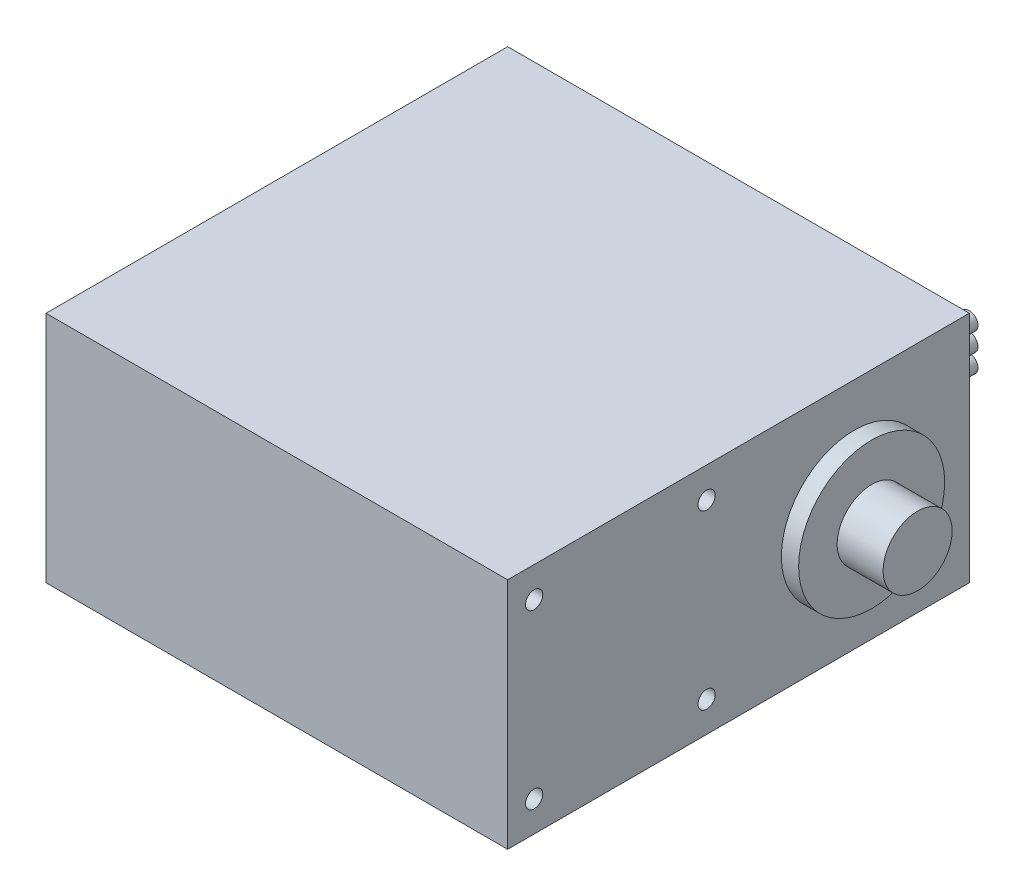
ISO-10303-21;
HEADER;
FILE_DESCRIPTION(('STEP AP214'),'2;1');
FILE_NAME('part.step','',(''),(''),'','','');
FILE_SCHEMA(('AUTOMOTIVE_DESIGN { 1 0 10303 214 1 1 1 1 }'));
ENDSEC;
DATA;
#1=APPLICATION_CONTEXT('core data for automotive mechanical design processes');
#2=APPLICATION_PROTOCOL_DEFINITION('international standard','automotive_design',2000,#1);
#3=PRODUCT_CONTEXT('',#1,'mechanical');
#4=PRODUCT('Part','Part','',(#3));
#5=PRODUCT_RELATED_PRODUCT_CATEGORY('part','',(#4));
#6=PRODUCT_DEFINITION_FORMATION('','',#4);
#7=PRODUCT_DEFINITION_CONTEXT('part definition',#1,'design');
#8=PRODUCT_DEFINITION('design','',#6,#7);
#9=PRODUCT_DEFINITION_SHAPE('','',#8);
#10=(LENGTH_UNIT() NAMED_UNIT(*) SI_UNIT(.MILLI.,.METRE.));
#11=(NAMED_UNIT(*) PLANE_ANGLE_UNIT() SI_UNIT($,.RADIAN.));
#12=(NAMED_UNIT(*) SI_UNIT($,.STERADIAN.) SOLID_ANGLE_UNIT());
#13=UNCERTAINTY_MEASURE_WITH_UNIT(LENGTH_MEASURE(1.E-05),#10,'distance_accuracy_value','');
#14=(GEOMETRIC_REPRESENTATION_CONTEXT(3) GLOBAL_UNCERTAINTY_ASSIGNED_CONTEXT((#13)) GLOBAL_UNIT_ASSIGNED_CONTEXT((#10,
#11,#12)) REPRESENTATION_CONTEXT('',''));
#15=CARTESIAN_POINT('',(0.,0.,0.));
#16=DIRECTION('',(0.,0.,1.));
#17=DIRECTION('',(1.,0.,0.));
#18=AXIS2_PLACEMENT_3D('',#15,#16,#17);
#19=CARTESIAN_POINT('',(-20.075,10.15,-20.075));
#20=DIRECTION('',(0.,0.,1.));
#21=DIRECTION('',(1.,0.,0.));
#22=AXIS2_PLACEMENT_3D('',#19,#20,#21);
#23=PLANE('',#22);
#24=DIRECTION('',(-1.,0.,0.));
#25=VECTOR('',#24,1.);
#26=CARTESIAN_POINT('',(-20.075,-10.15,-20.075));
#27=LINE('',#26,#25);
#28=CARTESIAN_POINT('',(20.075,-10.15,-20.075));
#29=VERTEX_POINT('',#28);
#30=CARTESIAN_POINT('',(-20.075,-10.15,-20.075));
#31=VERTEX_POINT('',#30);
#32=EDGE_CURVE('E162',#29,#31,#27,.T.);
#33=ORIENTED_EDGE('',*,*,#32,.T.);
#34=DIRECTION('',(0.,-1.,0.));
#35=VECTOR('',#34,1.);
#36=CARTESIAN_POINT('',(-20.075,10.15,-20.075));
#37=LINE('',#36,#35);
#38=CARTESIAN_POINT('',(-20.075,10.15,-20.075));
#39=VERTEX_POINT('',#38);
#40=EDGE_CURVE('E168',#39,#31,#37,.T.);
#41=ORIENTED_EDGE('',*,*,#40,.F.);
#42=DIRECTION('',(-1.,0.,0.));
#43=VECTOR('',#42,1.);
#44=CARTESIAN_POINT('',(-20.075,10.15,-20.075));
#45=LINE('',#44,#43);
#46=CARTESIAN_POINT('',(20.075,10.15,-20.075));
#47=VERTEX_POINT('',#46);
#48=EDGE_CURVE('E166',#47,#39,#45,.T.);
#49=ORIENTED_EDGE('',*,*,#48,.F.);
#50=DIRECTION('',(0.,-1.,0.));
#51=VECTOR('',#50,1.);
#52=CARTESIAN_POINT('',(20.075,10.15,-20.075));
#53=LINE('',#52,#51);
#54=EDGE_CURVE('E178',#47,#29,#53,.T.);
#55=ORIENTED_EDGE('',*,*,#54,.T.);
#56=EDGE_LOOP('',(#33,#41,#49,#55));
#57=FACE_BOUND('',#56,.T.);
#58=DIRECTION('',(1.,0.,0.));
#59=VECTOR('',#58,1.);
#60=CARTESIAN_POINT('',(14.075,4.15,-20.075));
#61=LINE('',#60,#59);
#62=CARTESIAN_POINT('',(10.075,4.15,-20.075));
#63=VERTEX_POINT('',#62);
#64=CARTESIAN_POINT('',(14.075,4.15,-20.075));
#65=VERTEX_POINT('',#64);
#66=EDGE_CURVE('E124',#63,#65,#61,.T.);
#67=ORIENTED_EDGE('',*,*,#66,.F.);
#68=DIRECTION('',(0.,1.,0.));
#69=VECTOR('',#68,1.);
#70=CARTESIAN_POINT('',(10.075,4.15,-20.075));
#71=LINE('',#70,#69);
#72=CARTESIAN_POINT('',(10.075,-4.15,-20.075));
#73=VERTEX_POINT('',#72);
#74=EDGE_CURVE('E121',#73,#63,#71,.T.);
#75=ORIENTED_EDGE('',*,*,#74,.F.);
#76=DIRECTION('',(-1.,0.,0.));
#77=VECTOR('',#76,1.);
#78=CARTESIAN_POINT('',(14.075,-4.15,-20.075));
#79=LINE('',#78,#77);
#80=CARTESIAN_POINT('',(14.075,-4.15,-20.075));
#81=VERTEX_POINT('',#80);
#82=EDGE_CURVE('E56',#81,#73,#79,.T.);
#83=ORIENTED_EDGE('',*,*,#82,.F.);
#84=DIRECTION('',(0.,-1.,0.));
#85=VECTOR('',#84,1.);
#86=CARTESIAN_POINT('',(14.075,4.15,-20.075));
#87=LINE('',#86,#85);
#88=EDGE_CURVE('E51',#65,#81,#87,.T.);
#89=ORIENTED_EDGE('',*,*,#88,.F.);
#90=EDGE_LOOP('',(#67,#75,#83,#89));
#91=FACE_BOUND('',#90,.T.);
#92=ADVANCED_FACE('F36',(#57,#91),#23,.F.);
#93=CARTESIAN_POINT('',(-20.075,10.15,20.075));
#94=DIRECTION('',(1.,0.,0.));
#95=DIRECTION('',(0.,0.,-1.));
#96=AXIS2_PLACEMENT_3D('',#93,#94,#95);
#97=PLANE('',#96);
#98=CARTESIAN_POINT('',(-20.075,0.,17.275));
#99=DIRECTION('',(-1.,0.,0.));
#100=DIRECTION('',(0.,0.,1.));
#101=AXIS2_PLACEMENT_3D('',#98,#99,#100);
#102=CIRCLE('',#101,0.750000000000002);
#103=CARTESIAN_POINT('',(-20.075,0.,18.025));
#104=VERTEX_POINT('',#103);
#105=EDGE_CURVE('E557',#104,#104,#102,.T.);
#106=ORIENTED_EDGE('',*,*,#105,.F.);
#107=EDGE_LOOP('',(#106));
#108=FACE_BOUND('',#107,.T.);
#109=CARTESIAN_POINT('',(-20.075,7.,10.275));
#110=DIRECTION('',(-1.,0.,0.));
#111=DIRECTION('',(0.,0.,1.));
#112=AXIS2_PLACEMENT_3D('',#109,#110,#111);
#113=CIRCLE('',#112,0.75);
#114=CARTESIAN_POINT('',(-20.075,7.,11.025));
#115=VERTEX_POINT('',#114);
#116=EDGE_CURVE('E568',#115,#115,#113,.T.);
#117=ORIENTED_EDGE('',*,*,#116,.F.);
#118=EDGE_LOOP('',(#117));
#119=FACE_BOUND('',#118,.T.);
#120=CARTESIAN_POINT('',(-20.075,-7.,10.275));
#121=DIRECTION('',(-1.,0.,0.));
#122=DIRECTION('',(0.,0.,-1.));
#123=AXIS2_PLACEMENT_3D('',#120,#121,#122);
#124=CIRCLE('',#123,0.75);
#125=CARTESIAN_POINT('',(-20.075,-7.,9.525));
#126=VERTEX_POINT('',#125);
#127=EDGE_CURVE('E574',#126,#126,#124,.T.);
#128=ORIENTED_EDGE('',*,*,#127,.F.);
#129=EDGE_LOOP('',(#128));
#130=FACE_BOUND('',#129,.T.);
#131=CARTESIAN_POINT('',(-20.075,0.,-10.075));
#132=DIRECTION('',(1.,0.,0.));
#133=DIRECTION('',(0.,0.,-1.));
#134=AXIS2_PLACEMENT_3D('',#131,#132,#133);
#135=CIRCLE('',#134,6.15);
#136=CARTESIAN_POINT('',(-20.075,0.,-16.225));
#137=VERTEX_POINT('',#136);
#138=EDGE_CURVE('E154',#137,#137,#135,.F.);
#139=ORIENTED_EDGE('',*,*,#138,.F.);
#140=EDGE_LOOP('',(#139));
#141=FACE_BOUND('',#140,.T.);
#142=DIRECTION('',(0.,0.,1.));
#143=VECTOR('',#142,1.);
#144=CARTESIAN_POINT('',(-20.075,-10.15,20.075));
#145=LINE('',#144,#143);
#146=CARTESIAN_POINT('',(-20.075,-10.15,20.075));
#147=VERTEX_POINT('',#146);
#148=EDGE_CURVE('E157',#31,#147,#145,.T.);
#149=ORIENTED_EDGE('',*,*,#148,.T.);
#150=DIRECTION('',(0.,-1.,0.));
#151=VECTOR('',#150,1.);
#152=CARTESIAN_POINT('',(-20.075,10.15,20.075));
#153=LINE('',#152,#151);
#154=CARTESIAN_POINT('',(-20.075,10.15,20.075));
#155=VERTEX_POINT('',#154);
#156=EDGE_CURVE('E184',#155,#147,#153,.T.);
#157=ORIENTED_EDGE('',*,*,#156,.F.);
#158=DIRECTION('',(0.,0.,1.));
#159=VECTOR('',#158,1.);
#160=CARTESIAN_POINT('',(-20.075,10.15,20.075));
#161=LINE('',#160,#159);
#162=EDGE_CURVE('E158',#39,#155,#161,.T.);
#163=ORIENTED_EDGE('',*,*,#162,.F.);
#164=ORIENTED_EDGE('',*,*,#40,.T.);
#165=EDGE_LOOP('',(#149,#157,#163,#164));
#166=FACE_BOUND('',#165,.T.);
#167=ADVANCED_FACE('F38',(#108,#119,#130,#141,#166),#97,.F.);
#168=CARTESIAN_POINT('',(-20.075,10.15,20.075));
#169=DIRECTION('',(0.,0.,-1.));
#170=DIRECTION('',(-1.,0.,0.));
#171=AXIS2_PLACEMENT_3D('',#168,#169,#170);
#172=PLANE('',#171);
#173=DIRECTION('',(1.,0.,0.));
#174=VECTOR('',#173,1.);
#175=CARTESIAN_POINT('',(-20.075,-10.15,20.075));
#176=LINE('',#175,#174);
#177=CARTESIAN_POINT('',(20.075,-10.15,20.075));
#178=VERTEX_POINT('',#177);
#179=EDGE_CURVE('E171',#147,#178,#176,.T.);
#180=ORIENTED_EDGE('',*,*,#179,.T.);
#181=DIRECTION('',(0.,-1.,0.));
#182=VECTOR('',#181,1.);
#183=CARTESIAN_POINT('',(20.075,10.15,20.075));
#184=LINE('',#183,#182);
#185=CARTESIAN_POINT('',(20.075,10.15,20.075));
#186=VERTEX_POINT('',#185);
#187=EDGE_CURVE('E181',#186,#178,#184,.T.);
#188=ORIENTED_EDGE('',*,*,#187,.F.);
#189=DIRECTION('',(1.,0.,0.));
#190=VECTOR('',#189,1.);
#191=CARTESIAN_POINT('',(-20.075,10.15,20.075));
#192=LINE('',#191,#190);
#193=EDGE_CURVE('E161',#155,#186,#192,.T.);
#194=ORIENTED_EDGE('',*,*,#193,.F.);
#195=ORIENTED_EDGE('',*,*,#156,.T.);
#196=EDGE_LOOP('',(#180,#188,#194,#195));
#197=FACE_BOUND('',#196,.T.);
#198=ADVANCED_FACE('F229',(#197),#172,.F.);
#199=CARTESIAN_POINT('',(20.075,10.15,20.075));
#200=DIRECTION('',(-1.,0.,0.));
#201=DIRECTION('',(0.,0.,1.));
#202=AXIS2_PLACEMENT_3D('',#199,#200,#201);
#203=PLANE('',#202);
#204=CARTESIAN_POINT('',(20.075,7.5,2.77499999999999));
#205=DIRECTION('',(1.,0.,0.));
#206=DIRECTION('',(0.,0.,-1.));
#207=AXIS2_PLACEMENT_3D('',#204,#205,#206);
#208=CIRCLE('',#207,0.75);
#209=CARTESIAN_POINT('',(20.075,7.5,2.02499999999999));
#210=VERTEX_POINT('',#209);
#211=EDGE_CURVE('E584',#210,#210,#208,.T.);
#212=ORIENTED_EDGE('',*,*,#211,.F.);
#213=EDGE_LOOP('',(#212));
#214=FACE_BOUND('',#213,.T.);
#215=CARTESIAN_POINT('',(20.075,-7.5,17.775));
#216=DIRECTION('',(1.,0.,0.));
#217=DIRECTION('',(0.,0.,-1.));
#218=AXIS2_PLACEMENT_3D('',#215,#216,#217);
#219=CIRCLE('',#218,0.750000000000002);
#220=CARTESIAN_POINT('',(20.075,-7.5,17.025));
#221=VERTEX_POINT('',#220);
#222=EDGE_CURVE('E578',#221,#221,#219,.T.);
#223=ORIENTED_EDGE('',*,*,#222,.F.);
#224=EDGE_LOOP('',(#223));
#225=FACE_BOUND('',#224,.T.);
#226=CARTESIAN_POINT('',(20.075,-7.5,2.77499999999999));
#227=DIRECTION('',(1.,0.,0.));
#228=DIRECTION('',(0.,0.,-1.));
#229=AXIS2_PLACEMENT_3D('',#226,#227,#228);
#230=CIRCLE('',#229,0.75);
#231=CARTESIAN_POINT('',(20.075,-7.5,2.02499999999999));
#232=VERTEX_POINT('',#231);
#233=EDGE_CURVE('E556',#232,#232,#230,.T.);
#234=ORIENTED_EDGE('',*,*,#233,.F.);
#235=EDGE_LOOP('',(#234));
#236=FACE_BOUND('',#235,.T.);
#237=CARTESIAN_POINT('',(20.075,7.5,17.775));
#238=DIRECTION('',(1.,0.,0.));
#239=DIRECTION('',(0.,0.,-1.));
#240=AXIS2_PLACEMENT_3D('',#237,#238,#239);
#241=CIRCLE('',#240,0.750000000000002);
#242=CARTESIAN_POINT('',(20.075,7.5,17.025));
#243=VERTEX_POINT('',#242);
#244=EDGE_CURVE('E583',#243,#243,#241,.T.);
#245=ORIENTED_EDGE('',*,*,#244,.F.);
#246=EDGE_LOOP('',(#245));
#247=FACE_BOUND('',#246,.T.);
#248=CARTESIAN_POINT('',(20.075,0.,-10.075));
#249=DIRECTION('',(-1.,0.,0.));
#250=DIRECTION('',(0.,0.,1.));
#251=AXIS2_PLACEMENT_3D('',#248,#249,#250);
#252=CIRCLE('',#251,6.35);
#253=CARTESIAN_POINT('',(20.075,0.,-3.725));
#254=VERTEX_POINT('',#253);
#255=EDGE_CURVE('E138',#254,#254,#252,.F.);
#256=ORIENTED_EDGE('',*,*,#255,.F.);
#257=EDGE_LOOP('',(#256));
#258=FACE_BOUND('',#257,.T.);
#259=DIRECTION('',(0.,0.,-1.));
#260=VECTOR('',#259,1.);
#261=CARTESIAN_POINT('',(20.075,-10.15,20.075));
#262=LINE('',#261,#260);
#263=EDGE_CURVE('E173',#178,#29,#262,.T.);
#264=ORIENTED_EDGE('',*,*,#263,.T.);
#265=ORIENTED_EDGE('',*,*,#54,.F.);
#266=DIRECTION('',(0.,0.,-1.));
#267=VECTOR('',#266,1.);
#268=CARTESIAN_POINT('',(20.075,10.15,20.075));
#269=LINE('',#268,#267);
#270=EDGE_CURVE('E164',#186,#47,#269,.T.);
#271=ORIENTED_EDGE('',*,*,#270,.F.);
#272=ORIENTED_EDGE('',*,*,#187,.T.);
#273=EDGE_LOOP('',(#264,#265,#271,#272));
#274=FACE_BOUND('',#273,.T.);
#275=ADVANCED_FACE('F235',(#214,#225,#236,#247,#258,#274),#203,.F.);
#276=CARTESIAN_POINT('',(0.,10.15,0.));
#277=DIRECTION('',(0.,-1.,0.));
#278=DIRECTION('',(0.,0.,-1.));
#279=AXIS2_PLACEMENT_3D('',#276,#277,#278);
#280=PLANE('',#279);
#281=ORIENTED_EDGE('',*,*,#162,.T.);
#282=ORIENTED_EDGE('',*,*,#193,.T.);
#283=ORIENTED_EDGE('',*,*,#270,.T.);
#284=ORIENTED_EDGE('',*,*,#48,.T.);
#285=EDGE_LOOP('',(#281,#282,#283,#284));
#286=FACE_BOUND('',#285,.T.);
#287=ADVANCED_FACE('F237',(#286),#280,.F.);
#288=CARTESIAN_POINT('',(0.,-10.15,0.));
#289=DIRECTION('',(0.,-1.,0.));
#290=DIRECTION('',(0.,0.,-1.));
#291=AXIS2_PLACEMENT_3D('',#288,#289,#290);
#292=PLANE('',#291);
#293=ORIENTED_EDGE('',*,*,#148,.F.);
#294=ORIENTED_EDGE('',*,*,#32,.F.);
#295=ORIENTED_EDGE('',*,*,#263,.F.);
#296=ORIENTED_EDGE('',*,*,#179,.F.);
#297=EDGE_LOOP('',(#293,#294,#295,#296));
#298=FACE_BOUND('',#297,.T.);
#299=ADVANCED_FACE('F233',(#298),#292,.T.);
#300=CARTESIAN_POINT('',(-21.575,0.,-10.075));
#301=DIRECTION('',(1.,0.,0.));
#302=DIRECTION('',(0.,0.,-1.));
#303=AXIS2_PLACEMENT_3D('',#300,#301,#302);
#304=CYLINDRICAL_SURFACE('',#303,6.15);
#305=CARTESIAN_POINT('',(-21.575,0.,-10.075));
#306=DIRECTION('',(-1.,0.,0.));
#307=DIRECTION('',(0.,0.,1.));
#308=AXIS2_PLACEMENT_3D('',#305,#306,#307);
#309=CIRCLE('',#308,6.15);
#310=CARTESIAN_POINT('',(-21.575,0.,-3.925));
#311=VERTEX_POINT('',#310);
#312=EDGE_CURVE('E150',#311,#311,#309,.T.);
#313=ORIENTED_EDGE('',*,*,#312,.F.);
#314=EDGE_LOOP('',(#313));
#315=FACE_BOUND('',#314,.T.);
#316=ORIENTED_EDGE('',*,*,#138,.T.);
#317=EDGE_LOOP('',(#316));
#318=FACE_BOUND('',#317,.T.);
#319=ADVANCED_FACE('F261',(#315,#318),#304,.T.);
#320=CARTESIAN_POINT('',(-21.575,0.,-10.075));
#321=DIRECTION('',(-1.,0.,0.));
#322=DIRECTION('',(0.,0.,1.));
#323=AXIS2_PLACEMENT_3D('',#320,#321,#322);
#324=PLANE('',#323);
#325=CARTESIAN_POINT('',(-21.575,0.,-10.075));
#326=DIRECTION('',(-1.,0.,0.));
#327=DIRECTION('',(0.,0.,1.));
#328=AXIS2_PLACEMENT_3D('',#325,#326,#327);
#329=CIRCLE('',#328,2.9);
#330=CARTESIAN_POINT('',(-21.575,0.,-7.175));
#331=VERTEX_POINT('',#330);
#332=EDGE_CURVE('E151',#331,#331,#329,.T.);
#333=ORIENTED_EDGE('',*,*,#332,.F.);
#334=EDGE_LOOP('',(#333));
#335=FACE_BOUND('',#334,.T.);
#336=ORIENTED_EDGE('',*,*,#312,.T.);
#337=EDGE_LOOP('',(#336));
#338=FACE_BOUND('',#337,.T.);
#339=ADVANCED_FACE('F265',(#335,#338),#324,.T.);
#340=CARTESIAN_POINT('',(-25.925,0.,-10.075));
#341=DIRECTION('',(1.,0.,0.));
#342=DIRECTION('',(0.,0.,-1.));
#343=AXIS2_PLACEMENT_3D('',#340,#341,#342);
#344=CYLINDRICAL_SURFACE('',#343,2.9);
#345=CARTESIAN_POINT('',(-25.925,0.,-10.075));
#346=DIRECTION('',(-1.,0.,0.));
#347=DIRECTION('',(0.,0.,1.));
#348=AXIS2_PLACEMENT_3D('',#345,#346,#347);
#349=CIRCLE('',#348,2.9);
#350=CARTESIAN_POINT('',(-25.925,0.,-7.175));
#351=VERTEX_POINT('',#350);
#352=EDGE_CURVE('E147',#351,#351,#349,.T.);
#353=ORIENTED_EDGE('',*,*,#352,.F.);
#354=EDGE_LOOP('',(#353));
#355=FACE_BOUND('',#354,.T.);
#356=ORIENTED_EDGE('',*,*,#332,.T.);
#357=EDGE_LOOP('',(#356));
#358=FACE_BOUND('',#357,.T.);
#359=ADVANCED_FACE('F269',(#355,#358),#344,.T.);
#360=CARTESIAN_POINT('',(-25.925,0.,-10.075));
#361=DIRECTION('',(-1.,0.,0.));
#362=DIRECTION('',(0.,0.,1.));
#363=AXIS2_PLACEMENT_3D('',#360,#361,#362);
#364=PLANE('',#363);
#365=CARTESIAN_POINT('',(-25.925,0.,-10.075));
#366=DIRECTION('',(-1.,0.,0.));
#367=DIRECTION('',(0.,0.,1.));
#368=AXIS2_PLACEMENT_3D('',#365,#366,#367);
#369=CIRCLE('',#368,1.5);
#370=CARTESIAN_POINT('',(-25.925,0.,-8.575));
#371=VERTEX_POINT('',#370);
#372=EDGE_CURVE('E141',#371,#371,#369,.T.);
#373=ORIENTED_EDGE('',*,*,#372,.F.);
#374=EDGE_LOOP('',(#373));
#375=FACE_BOUND('',#374,.T.);
#376=ORIENTED_EDGE('',*,*,#352,.T.);
#377=EDGE_LOOP('',(#376));
#378=FACE_BOUND('',#377,.T.);
#379=ADVANCED_FACE('F273',(#375,#378),#364,.T.);
#380=CARTESIAN_POINT('',(-19.925,0.,-10.075));
#381=DIRECTION('',(-1.,0.,0.));
#382=DIRECTION('',(0.,0.,1.));
#383=AXIS2_PLACEMENT_3D('',#380,#381,#382);
#384=CONICAL_SURFACE('',#383,1.5,1.02974425867665);
#385=CARTESIAN_POINT('',(-19.0237090714587,0.,-10.075));
#386=VERTEX_POINT('',#385);
#387=VERTEX_LOOP('',#386);
#388=FACE_BOUND('',#387,.T.);
#389=CARTESIAN_POINT('',(-19.925,0.,-10.075));
#390=DIRECTION('',(-1.,0.,0.));
#391=DIRECTION('',(0.,0.,1.));
#392=AXIS2_PLACEMENT_3D('',#389,#390,#391);
#393=CIRCLE('',#392,1.5);
#394=CARTESIAN_POINT('',(-19.925,0.,-8.575));
#395=VERTEX_POINT('',#394);
#396=EDGE_CURVE('E144',#395,#395,#393,.T.);
#397=ORIENTED_EDGE('',*,*,#396,.T.);
#398=EDGE_LOOP('',(#397));
#399=FACE_BOUND('',#398,.T.);
#400=ADVANCED_FACE('F277',(#388,#399),#384,.F.);
#401=CARTESIAN_POINT('',(-25.925,0.,-10.075));
#402=DIRECTION('',(-1.,0.,0.));
#403=DIRECTION('',(0.,0.,1.));
#404=AXIS2_PLACEMENT_3D('',#401,#402,#403);
#405=CYLINDRICAL_SURFACE('',#404,1.5);
#406=ORIENTED_EDGE('',*,*,#396,.F.);
#407=EDGE_LOOP('',(#406));
#408=FACE_BOUND('',#407,.T.);
#409=ORIENTED_EDGE('',*,*,#372,.T.);
#410=EDGE_LOOP('',(#409));
#411=FACE_BOUND('',#410,.T.);
#412=ADVANCED_FACE('F281',(#408,#411),#405,.F.);
#413=CARTESIAN_POINT('',(21.575,0.,-10.075));
#414=DIRECTION('',(-1.,0.,0.));
#415=DIRECTION('',(0.,0.,1.));
#416=AXIS2_PLACEMENT_3D('',#413,#414,#415);
#417=CYLINDRICAL_SURFACE('',#416,6.35);
#418=CARTESIAN_POINT('',(21.575,0.,-10.075));
#419=DIRECTION('',(1.,0.,0.));
#420=DIRECTION('',(0.,0.,-1.));
#421=AXIS2_PLACEMENT_3D('',#418,#419,#420);
#422=CIRCLE('',#421,6.35);
#423=CARTESIAN_POINT('',(21.575,0.,-16.425));
#424=VERTEX_POINT('',#423);
#425=EDGE_CURVE('E128',#424,#424,#422,.T.);
#426=ORIENTED_EDGE('',*,*,#425,.F.);
#427=EDGE_LOOP('',(#426));
#428=FACE_BOUND('',#427,.T.);
#429=ORIENTED_EDGE('',*,*,#255,.T.);
#430=EDGE_LOOP('',(#429));
#431=FACE_BOUND('',#430,.T.);
#432=ADVANCED_FACE('F285',(#428,#431),#417,.T.);
#433=CARTESIAN_POINT('',(21.575,0.,-10.075));
#434=DIRECTION('',(1.,0.,0.));
#435=DIRECTION('',(0.,0.,-1.));
#436=AXIS2_PLACEMENT_3D('',#433,#434,#435);
#437=PLANE('',#436);
#438=CARTESIAN_POINT('',(21.575,0.,-10.075));
#439=DIRECTION('',(1.,0.,0.));
#440=DIRECTION('',(0.,0.,-1.));
#441=AXIS2_PLACEMENT_3D('',#438,#439,#440);
#442=CIRCLE('',#441,3.);
#443=CARTESIAN_POINT('',(21.575,0.,-13.075));
#444=VERTEX_POINT('',#443);
#445=EDGE_CURVE('E134',#444,#444,#442,.T.);
#446=ORIENTED_EDGE('',*,*,#445,.F.);
#447=EDGE_LOOP('',(#446));
#448=FACE_BOUND('',#447,.T.);
#449=ORIENTED_EDGE('',*,*,#425,.T.);
#450=EDGE_LOOP('',(#449));
#451=FACE_BOUND('',#450,.T.);
#452=ADVANCED_FACE('F289',(#448,#451),#437,.T.);
#453=CARTESIAN_POINT('',(25.575,0.,-10.075));
#454=DIRECTION('',(-1.,0.,0.));
#455=DIRECTION('',(0.,0.,1.));
#456=AXIS2_PLACEMENT_3D('',#453,#454,#455);
#457=CYLINDRICAL_SURFACE('',#456,3.);
#458=CARTESIAN_POINT('',(25.575,0.,-10.075));
#459=DIRECTION('',(1.,0.,0.));
#460=DIRECTION('',(0.,0.,-1.));
#461=AXIS2_PLACEMENT_3D('',#458,#459,#460);
#462=CIRCLE('',#461,3.);
#463=CARTESIAN_POINT('',(25.575,0.,-13.075));
#464=VERTEX_POINT('',#463);
#465=EDGE_CURVE('E125',#464,#464,#462,.T.);
#466=ORIENTED_EDGE('',*,*,#465,.F.);
#467=EDGE_LOOP('',(#466));
#468=FACE_BOUND('',#467,.T.);
#469=ORIENTED_EDGE('',*,*,#445,.T.);
#470=EDGE_LOOP('',(#469));
#471=FACE_BOUND('',#470,.T.);
#472=ADVANCED_FACE('F293',(#468,#471),#457,.T.);
#473=CARTESIAN_POINT('',(25.575,0.,-10.075));
#474=DIRECTION('',(1.,0.,0.));
#475=DIRECTION('',(0.,0.,-1.));
#476=AXIS2_PLACEMENT_3D('',#473,#474,#475);
#477=PLANE('',#476);
#478=ORIENTED_EDGE('',*,*,#465,.T.);
#479=EDGE_LOOP('',(#478));
#480=FACE_BOUND('',#479,.T.);
#481=ADVANCED_FACE('F297',(#480),#477,.T.);
#482=CARTESIAN_POINT('',(14.075,4.15,-24.075));
#483=DIRECTION('',(0.,-1.,0.));
#484=DIRECTION('',(1.,0.,0.));
#485=AXIS2_PLACEMENT_3D('',#482,#483,#484);
#486=PLANE('',#485);
#487=ORIENTED_EDGE('',*,*,#66,.T.);
#488=DIRECTION('',(0.,0.,1.));
#489=VECTOR('',#488,1.);
#490=CARTESIAN_POINT('',(14.075,4.15,-24.075));
#491=LINE('',#490,#489);
#492=CARTESIAN_POINT('',(14.075,4.15,-24.075));
#493=VERTEX_POINT('',#492);
#494=EDGE_CURVE('E105',#493,#65,#491,.T.);
#495=ORIENTED_EDGE('',*,*,#494,.F.);
#496=DIRECTION('',(1.,0.,0.));
#497=VECTOR('',#496,1.);
#498=CARTESIAN_POINT('',(14.075,4.15,-24.075));
#499=LINE('',#498,#497);
#500=CARTESIAN_POINT('',(10.075,4.15,-24.075));
#501=VERTEX_POINT('',#500);
#502=EDGE_CURVE('E112',#501,#493,#499,.T.);
#503=ORIENTED_EDGE('',*,*,#502,.F.);
#504=DIRECTION('',(0.,0.,1.));
#505=VECTOR('',#504,1.);
#506=CARTESIAN_POINT('',(10.075,4.15,-24.075));
#507=LINE('',#506,#505);
#508=EDGE_CURVE('E203',#501,#63,#507,.T.);
#509=ORIENTED_EDGE('',*,*,#508,.T.);
#510=EDGE_LOOP('',(#487,#495,#503,#509));
#511=FACE_BOUND('',#510,.T.);
#512=ADVANCED_FACE('F123',(#511),#486,.F.);
#513=CARTESIAN_POINT('',(14.075,4.15,-24.075));
#514=DIRECTION('',(-1.,0.,0.));
#515=DIRECTION('',(0.,-1.,0.));
#516=AXIS2_PLACEMENT_3D('',#513,#514,#515);
#517=PLANE('',#516);
#518=ORIENTED_EDGE('',*,*,#88,.T.);
#519=DIRECTION('',(0.,0.,1.));
#520=VECTOR('',#519,1.);
#521=CARTESIAN_POINT('',(14.075,-4.15,-24.075));
#522=LINE('',#521,#520);
#523=CARTESIAN_POINT('',(14.075,-4.15,-24.075));
#524=VERTEX_POINT('',#523);
#525=EDGE_CURVE('E108',#524,#81,#522,.T.);
#526=ORIENTED_EDGE('',*,*,#525,.F.);
#527=DIRECTION('',(0.,-1.,0.));
#528=VECTOR('',#527,1.);
#529=CARTESIAN_POINT('',(14.075,4.15,-24.075));
#530=LINE('',#529,#528);
#531=EDGE_CURVE('E101',#493,#524,#530,.T.);
#532=ORIENTED_EDGE('',*,*,#531,.F.);
#533=ORIENTED_EDGE('',*,*,#494,.T.);
#534=EDGE_LOOP('',(#518,#526,#532,#533));
#535=FACE_BOUND('',#534,.T.);
#536=ADVANCED_FACE('F103',(#535),#517,.F.);
#537=CARTESIAN_POINT('',(14.075,-4.15,-24.075));
#538=DIRECTION('',(0.,1.,0.));
#539=DIRECTION('',(0.,0.,1.));
#540=AXIS2_PLACEMENT_3D('',#537,#538,#539);
#541=PLANE('',#540);
#542=ORIENTED_EDGE('',*,*,#82,.T.);
#543=DIRECTION('',(0.,0.,1.));
#544=VECTOR('',#543,1.);
#545=CARTESIAN_POINT('',(10.075,-4.15,-24.075));
#546=LINE('',#545,#544);
#547=CARTESIAN_POINT('',(10.075,-4.15,-24.075));
#548=VERTEX_POINT('',#547);
#549=EDGE_CURVE('E130',#548,#73,#546,.T.);
#550=ORIENTED_EDGE('',*,*,#549,.F.);
#551=DIRECTION('',(-1.,0.,0.));
#552=VECTOR('',#551,1.);
#553=CARTESIAN_POINT('',(14.075,-4.15,-24.075));
#554=LINE('',#553,#552);
#555=EDGE_CURVE('E111',#524,#548,#554,.T.);
#556=ORIENTED_EDGE('',*,*,#555,.F.);
#557=ORIENTED_EDGE('',*,*,#525,.T.);
#558=EDGE_LOOP('',(#542,#550,#556,#557));
#559=FACE_BOUND('',#558,.T.);
#560=ADVANCED_FACE('F214',(#559),#541,.F.);
#561=CARTESIAN_POINT('',(10.075,4.15,-24.075));
#562=DIRECTION('',(1.,0.,0.));
#563=DIRECTION('',(0.,1.,0.));
#564=AXIS2_PLACEMENT_3D('',#561,#562,#563);
#565=PLANE('',#564);
#566=ORIENTED_EDGE('',*,*,#74,.T.);
#567=ORIENTED_EDGE('',*,*,#508,.F.);
#568=DIRECTION('',(0.,1.,0.));
#569=VECTOR('',#568,1.);
#570=CARTESIAN_POINT('',(10.075,4.15,-24.075));
#571=LINE('',#570,#569);
#572=EDGE_CURVE('E117',#548,#501,#571,.T.);
#573=ORIENTED_EDGE('',*,*,#572,.F.);
#574=ORIENTED_EDGE('',*,*,#549,.T.);
#575=EDGE_LOOP('',(#566,#567,#573,#574));
#576=FACE_BOUND('',#575,.T.);
#577=ADVANCED_FACE('F212',(#576),#565,.F.);
#578=CARTESIAN_POINT('',(0.,0.,-24.075));
#579=DIRECTION('',(0.,0.,1.));
#580=DIRECTION('',(1.,0.,0.));
#581=AXIS2_PLACEMENT_3D('',#578,#579,#580);
#582=PLANE('',#581);
#583=CARTESIAN_POINT('',(12.075,1.6,-24.075));
#584=DIRECTION('',(0.,0.,1.));
#585=DIRECTION('',(1.,0.,0.));
#586=AXIS2_PLACEMENT_3D('',#583,#584,#585);
#587=CIRCLE('',#586,0.75);
#588=CARTESIAN_POINT('',(12.825,1.6,-24.075));
#589=VERTEX_POINT('',#588);
#590=EDGE_CURVE('E11',#589,#589,#587,.F.);
#591=ORIENTED_EDGE('',*,*,#590,.F.);
#592=EDGE_LOOP('',(#591));
#593=FACE_BOUND('',#592,.T.);
#594=CARTESIAN_POINT('',(12.075,-1.6,-24.075));
#595=DIRECTION('',(0.,0.,1.));
#596=DIRECTION('',(1.,0.,0.));
#597=AXIS2_PLACEMENT_3D('',#594,#595,#596);
#598=CIRCLE('',#597,0.75);
#599=CARTESIAN_POINT('',(12.825,-1.6,-24.075));
#600=VERTEX_POINT('',#599);
#601=EDGE_CURVE('E44',#600,#600,#598,.F.);
#602=ORIENTED_EDGE('',*,*,#601,.F.);
#603=EDGE_LOOP('',(#602));
#604=FACE_BOUND('',#603,.T.);
#605=CARTESIAN_POINT('',(12.075,0.,-24.075));
#606=DIRECTION('',(0.,0.,-1.));
#607=DIRECTION('',(-1.,0.,0.));
#608=AXIS2_PLACEMENT_3D('',#605,#606,#607);
#609=CIRCLE('',#608,0.75);
#610=CARTESIAN_POINT('',(11.325,0.,-24.075));
#611=VERTEX_POINT('',#610);
#612=EDGE_CURVE('E137',#611,#611,#609,.T.);
#613=ORIENTED_EDGE('',*,*,#612,.F.);
#614=EDGE_LOOP('',(#613));
#615=FACE_BOUND('',#614,.T.);
#616=ORIENTED_EDGE('',*,*,#502,.T.);
#617=ORIENTED_EDGE('',*,*,#531,.T.);
#618=ORIENTED_EDGE('',*,*,#555,.T.);
#619=ORIENTED_EDGE('',*,*,#572,.T.);
#620=EDGE_LOOP('',(#616,#617,#618,#619));
#621=FACE_BOUND('',#620,.T.);
#622=ADVANCED_FACE('F115',(#593,#604,#615,#621),#582,.F.);
#623=CARTESIAN_POINT('',(12.075,0.,-28.075));
#624=DIRECTION('',(0.,0.,1.));
#625=DIRECTION('',(1.,0.,0.));
#626=AXIS2_PLACEMENT_3D('',#623,#624,#625);
#627=CYLINDRICAL_SURFACE('',#626,0.75);
#628=CARTESIAN_POINT('',(12.075,0.,-28.075));
#629=DIRECTION('',(0.,0.,-1.));
#630=DIRECTION('',(-1.,0.,0.));
#631=AXIS2_PLACEMENT_3D('',#628,#629,#630);
#632=CIRCLE('',#631,0.75);
#633=CARTESIAN_POINT('',(11.325,0.,-28.075));
#634=VERTEX_POINT('',#633);
#635=EDGE_CURVE('E198',#634,#634,#632,.T.);
#636=ORIENTED_EDGE('',*,*,#635,.F.);
#637=EDGE_LOOP('',(#636));
#638=FACE_BOUND('',#637,.T.);
#639=ORIENTED_EDGE('',*,*,#612,.T.);
#640=EDGE_LOOP('',(#639));
#641=FACE_BOUND('',#640,.T.);
#642=ADVANCED_FACE('F330',(#638,#641),#627,.T.);
#643=CARTESIAN_POINT('',(12.075,0.,-28.075));
#644=DIRECTION('',(0.,0.,-1.));
#645=DIRECTION('',(-1.,0.,0.));
#646=AXIS2_PLACEMENT_3D('',#643,#644,#645);
#647=PLANE('',#646);
#648=ORIENTED_EDGE('',*,*,#635,.T.);
#649=EDGE_LOOP('',(#648));
#650=FACE_BOUND('',#649,.T.);
#651=ADVANCED_FACE('F341',(#650),#647,.T.);
#652=CARTESIAN_POINT('',(12.075,-1.6,-28.075));
#653=DIRECTION('',(0.,0.,1.));
#654=DIRECTION('',(1.,0.,0.));
#655=AXIS2_PLACEMENT_3D('',#652,#653,#654);
#656=CYLINDRICAL_SURFACE('',#655,0.75);
#657=CARTESIAN_POINT('',(12.075,-1.6,-28.075));
#658=DIRECTION('',(0.,0.,-1.));
#659=DIRECTION('',(-1.,0.,0.));
#660=AXIS2_PLACEMENT_3D('',#657,#658,#659);
#661=CIRCLE('',#660,0.75);
#662=CARTESIAN_POINT('',(11.325,-1.6,-28.075));
#663=VERTEX_POINT('',#662);
#664=EDGE_CURVE('E599',#663,#663,#661,.T.);
#665=ORIENTED_EDGE('',*,*,#664,.F.);
#666=EDGE_LOOP('',(#665));
#667=FACE_BOUND('',#666,.T.);
#668=ORIENTED_EDGE('',*,*,#601,.T.);
#669=EDGE_LOOP('',(#668));
#670=FACE_BOUND('',#669,.T.);
#671=ADVANCED_FACE('F352',(#667,#670),#656,.T.);
#672=CARTESIAN_POINT('',(12.075,-1.6,-28.075));
#673=DIRECTION('',(0.,0.,-1.));
#674=DIRECTION('',(-1.,0.,0.));
#675=AXIS2_PLACEMENT_3D('',#672,#673,#674);
#676=PLANE('',#675);
#677=ORIENTED_EDGE('',*,*,#664,.T.);
#678=EDGE_LOOP('',(#677));
#679=FACE_BOUND('',#678,.T.);
#680=ADVANCED_FACE('F363',(#679),#676,.T.);
#681=CARTESIAN_POINT('',(12.075,1.6,-28.075));
#682=DIRECTION('',(0.,0.,1.));
#683=DIRECTION('',(1.,0.,0.));
#684=AXIS2_PLACEMENT_3D('',#681,#682,#683);
#685=CYLINDRICAL_SURFACE('',#684,0.75);
#686=CARTESIAN_POINT('',(12.075,1.6,-28.075));
#687=DIRECTION('',(0.,0.,-1.));
#688=DIRECTION('',(1.,0.,0.));
#689=AXIS2_PLACEMENT_3D('',#686,#687,#688);
#690=CIRCLE('',#689,0.75);
#691=CARTESIAN_POINT('',(12.825,1.6,-28.075));
#692=VERTEX_POINT('',#691);
#693=EDGE_CURVE('E595',#692,#692,#690,.T.);
#694=ORIENTED_EDGE('',*,*,#693,.F.);
#695=EDGE_LOOP('',(#694));
#696=FACE_BOUND('',#695,.T.);
#697=ORIENTED_EDGE('',*,*,#590,.T.);
#698=EDGE_LOOP('',(#697));
#699=FACE_BOUND('',#698,.T.);
#700=ADVANCED_FACE('F374',(#696,#699),#685,.T.);
#701=CARTESIAN_POINT('',(12.075,1.6,-28.075));
#702=DIRECTION('',(0.,0.,1.));
#703=DIRECTION('',(1.,0.,0.));
#704=AXIS2_PLACEMENT_3D('',#701,#702,#703);
#705=PLANE('',#704);
#706=ORIENTED_EDGE('',*,*,#693,.T.);
#707=EDGE_LOOP('',(#706));
#708=FACE_BOUND('',#707,.T.);
#709=ADVANCED_FACE('F385',(#708),#705,.F.);
#710=CARTESIAN_POINT('',(15.075,7.5,17.775));
#711=DIRECTION('',(1.,0.,0.));
#712=DIRECTION('',(0.,0.,-1.));
#713=AXIS2_PLACEMENT_3D('',#710,#711,#712);
#714=CYLINDRICAL_SURFACE('',#713,0.750000000000002);
#715=CARTESIAN_POINT('',(15.075,7.5,17.775));
#716=DIRECTION('',(1.,0.,0.));
#717=DIRECTION('',(0.,0.,-1.));
#718=AXIS2_PLACEMENT_3D('',#715,#716,#717);
#719=CIRCLE('',#718,0.750000000000002);
#720=CARTESIAN_POINT('',(15.075,7.5,17.025));
#721=VERTEX_POINT('',#720);
#722=EDGE_CURVE('E592',#721,#721,#719,.T.);
#723=ORIENTED_EDGE('',*,*,#722,.F.);
#724=EDGE_LOOP('',(#723));
#725=FACE_BOUND('',#724,.T.);
#726=ORIENTED_EDGE('',*,*,#244,.T.);
#727=EDGE_LOOP('',(#726));
#728=FACE_BOUND('',#727,.T.);
#729=ADVANCED_FACE('F395',(#725,#728),#714,.F.);
#730=CARTESIAN_POINT('',(15.075,7.5,17.775));
#731=DIRECTION('',(1.,0.,0.));
#732=DIRECTION('',(0.,0.,-1.));
#733=AXIS2_PLACEMENT_3D('',#730,#731,#732);
#734=PLANE('',#733);
#735=ORIENTED_EDGE('',*,*,#722,.T.);
#736=EDGE_LOOP('',(#735));
#737=FACE_BOUND('',#736,.T.);
#738=ADVANCED_FACE('F413',(#737),#734,.T.);
#739=CARTESIAN_POINT('',(15.075,-7.5,2.77499999999999));
#740=DIRECTION('',(1.,0.,0.));
#741=DIRECTION('',(0.,0.,-1.));
#742=AXIS2_PLACEMENT_3D('',#739,#740,#741);
#743=CYLINDRICAL_SURFACE('',#742,0.75);
#744=CARTESIAN_POINT('',(15.075,-7.5,2.77499999999999));
#745=DIRECTION('',(1.,0.,0.));
#746=DIRECTION('',(0.,0.,-1.));
#747=AXIS2_PLACEMENT_3D('',#744,#745,#746);
#748=CIRCLE('',#747,0.75);
#749=CARTESIAN_POINT('',(15.075,-7.5,2.02499999999999));
#750=VERTEX_POINT('',#749);
#751=EDGE_CURVE('E560',#750,#750,#748,.T.);
#752=ORIENTED_EDGE('',*,*,#751,.F.);
#753=EDGE_LOOP('',(#752));
#754=FACE_BOUND('',#753,.T.);
#755=ORIENTED_EDGE('',*,*,#233,.T.);
#756=EDGE_LOOP('',(#755));
#757=FACE_BOUND('',#756,.T.);
#758=ADVANCED_FACE('F423',(#754,#757),#743,.F.);
#759=CARTESIAN_POINT('',(15.075,-7.5,2.77499999999999));
#760=DIRECTION('',(1.,0.,0.));
#761=DIRECTION('',(0.,0.,-1.));
#762=AXIS2_PLACEMENT_3D('',#759,#760,#761);
#763=PLANE('',#762);
#764=ORIENTED_EDGE('',*,*,#751,.T.);
#765=EDGE_LOOP('',(#764));
#766=FACE_BOUND('',#765,.T.);
#767=ADVANCED_FACE('F433',(#766),#763,.T.);
#768=CARTESIAN_POINT('',(15.075,-7.5,17.775));
#769=DIRECTION('',(1.,0.,0.));
#770=DIRECTION('',(0.,0.,-1.));
#771=AXIS2_PLACEMENT_3D('',#768,#769,#770);
#772=CYLINDRICAL_SURFACE('',#771,0.750000000000002);
#773=CARTESIAN_POINT('',(15.075,-7.5,17.775));
#774=DIRECTION('',(1.,0.,0.));
#775=DIRECTION('',(0.,0.,-1.));
#776=AXIS2_PLACEMENT_3D('',#773,#774,#775);
#777=CIRCLE('',#776,0.750000000000002);
#778=CARTESIAN_POINT('',(15.075,-7.5,17.025));
#779=VERTEX_POINT('',#778);
#780=EDGE_CURVE('E587',#779,#779,#777,.T.);
#781=ORIENTED_EDGE('',*,*,#780,.F.);
#782=EDGE_LOOP('',(#781));
#783=FACE_BOUND('',#782,.T.);
#784=ORIENTED_EDGE('',*,*,#222,.T.);
#785=EDGE_LOOP('',(#784));
#786=FACE_BOUND('',#785,.T.);
#787=ADVANCED_FACE('F443',(#783,#786),#772,.F.);
#788=CARTESIAN_POINT('',(15.075,-7.5,17.775));
#789=DIRECTION('',(1.,0.,0.));
#790=DIRECTION('',(0.,0.,-1.));
#791=AXIS2_PLACEMENT_3D('',#788,#789,#790);
#792=PLANE('',#791);
#793=ORIENTED_EDGE('',*,*,#780,.T.);
#794=EDGE_LOOP('',(#793));
#795=FACE_BOUND('',#794,.T.);
#796=ADVANCED_FACE('F453',(#795),#792,.T.);
#797=CARTESIAN_POINT('',(15.075,7.5,2.77499999999999));
#798=DIRECTION('',(1.,0.,0.));
#799=DIRECTION('',(0.,0.,-1.));
#800=AXIS2_PLACEMENT_3D('',#797,#798,#799);
#801=CYLINDRICAL_SURFACE('',#800,0.75);
#802=CARTESIAN_POINT('',(15.075,7.5,2.77499999999999));
#803=DIRECTION('',(1.,0.,0.));
#804=DIRECTION('',(0.,0.,-1.));
#805=AXIS2_PLACEMENT_3D('',#802,#803,#804);
#806=CIRCLE('',#805,0.75);
#807=CARTESIAN_POINT('',(15.075,7.5,2.02499999999999));
#808=VERTEX_POINT('',#807);
#809=EDGE_CURVE('E580',#808,#808,#806,.T.);
#810=ORIENTED_EDGE('',*,*,#809,.F.);
#811=EDGE_LOOP('',(#810));
#812=FACE_BOUND('',#811,.T.);
#813=ORIENTED_EDGE('',*,*,#211,.T.);
#814=EDGE_LOOP('',(#813));
#815=FACE_BOUND('',#814,.T.);
#816=ADVANCED_FACE('F463',(#812,#815),#801,.F.);
#817=CARTESIAN_POINT('',(15.075,7.5,2.77499999999999));
#818=DIRECTION('',(1.,0.,0.));
#819=DIRECTION('',(0.,0.,-1.));
#820=AXIS2_PLACEMENT_3D('',#817,#818,#819);
#821=PLANE('',#820);
#822=ORIENTED_EDGE('',*,*,#809,.T.);
#823=EDGE_LOOP('',(#822));
#824=FACE_BOUND('',#823,.T.);
#825=ADVANCED_FACE('F473',(#824),#821,.T.);
#826=CARTESIAN_POINT('',(-15.075,-7.,10.275));
#827=DIRECTION('',(-1.,0.,0.));
#828=DIRECTION('',(0.,0.,1.));
#829=AXIS2_PLACEMENT_3D('',#826,#827,#828);
#830=CYLINDRICAL_SURFACE('',#829,0.75);
#831=CARTESIAN_POINT('',(-15.075,-7.,10.275));
#832=DIRECTION('',(-1.,0.,0.));
#833=DIRECTION('',(0.,0.,-1.));
#834=AXIS2_PLACEMENT_3D('',#831,#832,#833);
#835=CIRCLE('',#834,0.75);
#836=CARTESIAN_POINT('',(-15.075,-7.,9.525));
#837=VERTEX_POINT('',#836);
#838=EDGE_CURVE('E571',#837,#837,#835,.T.);
#839=ORIENTED_EDGE('',*,*,#838,.F.);
#840=EDGE_LOOP('',(#839));
#841=FACE_BOUND('',#840,.T.);
#842=ORIENTED_EDGE('',*,*,#127,.T.);
#843=EDGE_LOOP('',(#842));
#844=FACE_BOUND('',#843,.T.);
#845=ADVANCED_FACE('F483',(#841,#844),#830,.F.);
#846=CARTESIAN_POINT('',(-15.075,-7.,10.275));
#847=DIRECTION('',(1.,0.,0.));
#848=DIRECTION('',(0.,0.,-1.));
#849=AXIS2_PLACEMENT_3D('',#846,#847,#848);
#850=PLANE('',#849);
#851=ORIENTED_EDGE('',*,*,#838,.T.);
#852=EDGE_LOOP('',(#851));
#853=FACE_BOUND('',#852,.T.);
#854=ADVANCED_FACE('F499',(#853),#850,.F.);
#855=CARTESIAN_POINT('',(-15.075,7.,10.275));
#856=DIRECTION('',(-1.,0.,0.));
#857=DIRECTION('',(0.,0.,1.));
#858=AXIS2_PLACEMENT_3D('',#855,#856,#857);
#859=CYLINDRICAL_SURFACE('',#858,0.75);
#860=CARTESIAN_POINT('',(-15.075,7.,10.275));
#861=DIRECTION('',(-1.,0.,0.));
#862=DIRECTION('',(0.,0.,1.));
#863=AXIS2_PLACEMENT_3D('',#860,#861,#862);
#864=CIRCLE('',#863,0.75);
#865=CARTESIAN_POINT('',(-15.075,7.,11.025));
#866=VERTEX_POINT('',#865);
#867=EDGE_CURVE('E563',#866,#866,#864,.T.);
#868=ORIENTED_EDGE('',*,*,#867,.F.);
#869=EDGE_LOOP('',(#868));
#870=FACE_BOUND('',#869,.T.);
#871=ORIENTED_EDGE('',*,*,#116,.T.);
#872=EDGE_LOOP('',(#871));
#873=FACE_BOUND('',#872,.T.);
#874=ADVANCED_FACE('F509',(#870,#873),#859,.F.);
#875=CARTESIAN_POINT('',(-15.075,7.,10.275));
#876=DIRECTION('',(-1.,0.,0.));
#877=DIRECTION('',(0.,0.,1.));
#878=AXIS2_PLACEMENT_3D('',#875,#876,#877);
#879=PLANE('',#878);
#880=ORIENTED_EDGE('',*,*,#867,.T.);
#881=EDGE_LOOP('',(#880));
#882=FACE_BOUND('',#881,.T.);
#883=ADVANCED_FACE('F519',(#882),#879,.T.);
#884=CARTESIAN_POINT('',(-15.075,0.,17.275));
#885=DIRECTION('',(-1.,0.,0.));
#886=DIRECTION('',(0.,0.,1.));
#887=AXIS2_PLACEMENT_3D('',#884,#885,#886);
#888=CYLINDRICAL_SURFACE('',#887,0.750000000000002);
#889=CARTESIAN_POINT('',(-15.075,0.,17.275));
#890=DIRECTION('',(-1.,0.,0.));
#891=DIRECTION('',(0.,0.,1.));
#892=AXIS2_PLACEMENT_3D('',#889,#890,#891);
#893=CIRCLE('',#892,0.750000000000002);
#894=CARTESIAN_POINT('',(-15.075,0.,18.025));
#895=VERTEX_POINT('',#894);
#896=EDGE_CURVE('E555',#895,#895,#893,.T.);
#897=ORIENTED_EDGE('',*,*,#896,.F.);
#898=EDGE_LOOP('',(#897));
#899=FACE_BOUND('',#898,.T.);
#900=ORIENTED_EDGE('',*,*,#105,.T.);
#901=EDGE_LOOP('',(#900));
#902=FACE_BOUND('',#901,.T.);
#903=ADVANCED_FACE('F529',(#899,#902),#888,.F.);
#904=CARTESIAN_POINT('',(-15.075,0.,17.275));
#905=DIRECTION('',(-1.,0.,0.));
#906=DIRECTION('',(0.,0.,1.));
#907=AXIS2_PLACEMENT_3D('',#904,#905,#906);
#908=PLANE('',#907);
#909=ORIENTED_EDGE('',*,*,#896,.T.);
#910=EDGE_LOOP('',(#909));
#911=FACE_BOUND('',#910,.T.);
#912=ADVANCED_FACE('F539',(#911),#908,.T.);
#913=CLOSED_SHELL('',(#92,#167,#198,#275,#287,#299,#319,#339,#359,#379,#400,#412,#432,#452,#472,
#481,#512,#536,#560,#577,#622,#642,#651,#671,#680,#700,#709,#729,#738,#758,#767,#787,#796,#816,
#825,#845,#854,#874,#883,#903,#912));
#914=MANIFOLD_SOLID_BREP('B2',#913);
#915=ADVANCED_BREP_SHAPE_REPRESENTATION('',(#18,#914),#14);
#916=SHAPE_DEFINITION_REPRESENTATION(#9,#915);
ENDSEC;
END-ISO-10303-21;
